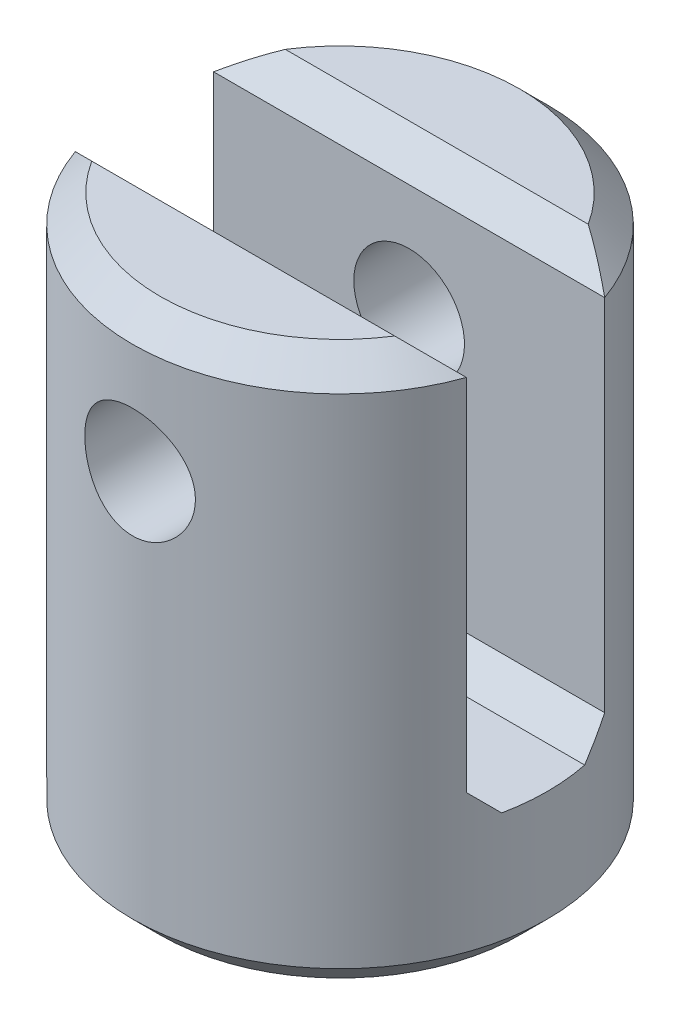
ISO-10303-21;
HEADER;
FILE_DESCRIPTION(('STEP AP214'),'2;1');
FILE_NAME('part.step','',(''),(''),'','','');
FILE_SCHEMA(('AUTOMOTIVE_DESIGN { 1 0 10303 214 1 1 1 1 }'));
ENDSEC;
DATA;
#1=APPLICATION_CONTEXT('core data for automotive mechanical design processes');
#2=APPLICATION_PROTOCOL_DEFINITION('international standard','automotive_design',2000,#1);
#3=PRODUCT_CONTEXT('',#1,'mechanical');
#4=PRODUCT('Part','Part','',(#3));
#5=PRODUCT_RELATED_PRODUCT_CATEGORY('part','',(#4));
#6=PRODUCT_DEFINITION_FORMATION('','',#4);
#7=PRODUCT_DEFINITION_CONTEXT('part definition',#1,'design');
#8=PRODUCT_DEFINITION('design','',#6,#7);
#9=PRODUCT_DEFINITION_SHAPE('','',#8);
#10=(LENGTH_UNIT() NAMED_UNIT(*) SI_UNIT(.MILLI.,.METRE.));
#11=(NAMED_UNIT(*) PLANE_ANGLE_UNIT() SI_UNIT($,.RADIAN.));
#12=(NAMED_UNIT(*) SI_UNIT($,.STERADIAN.) SOLID_ANGLE_UNIT());
#13=UNCERTAINTY_MEASURE_WITH_UNIT(LENGTH_MEASURE(1.E-05),#10,'distance_accuracy_value','');
#14=(GEOMETRIC_REPRESENTATION_CONTEXT(3) GLOBAL_UNCERTAINTY_ASSIGNED_CONTEXT((#13)) GLOBAL_UNIT_ASSIGNED_CONTEXT((#10,
#11,#12)) REPRESENTATION_CONTEXT('',''));
#15=CARTESIAN_POINT('',(0.,0.,0.));
#16=DIRECTION('',(0.,0.,1.));
#17=DIRECTION('',(1.,0.,0.));
#18=AXIS2_PLACEMENT_3D('',#15,#16,#17);
#19=CARTESIAN_POINT('',(0.,10.,0.));
#20=DIRECTION('',(0.,1.,0.));
#21=DIRECTION('',(0.,0.,1.));
#22=AXIS2_PLACEMENT_3D('',#19,#20,#21);
#23=PLANE('',#22);
#24=CARTESIAN_POINT('',(0.,10.,0.));
#25=DIRECTION('',(0.,1.,0.));
#26=DIRECTION('',(0.,0.,1.));
#27=AXIS2_PLACEMENT_3D('',#24,#25,#26);
#28=CIRCLE('',#27,6.5);
#29=CARTESIAN_POINT('',(-5.47722557505166,10.,3.5));
#30=VERTEX_POINT('',#29);
#31=CARTESIAN_POINT('',(5.47722557505166,10.,3.5));
#32=VERTEX_POINT('',#31);
#33=EDGE_CURVE('E136',#30,#32,#28,.T.);
#34=ORIENTED_EDGE('',*,*,#33,.T.);
#35=DIRECTION('',(-1.,0.,0.));
#36=VECTOR('',#35,1.);
#37=CARTESIAN_POINT('',(-7.07106781186548,10.,3.5));
#38=LINE('',#37,#36);
#39=EDGE_CURVE('E138',#32,#30,#38,.T.);
#40=ORIENTED_EDGE('',*,*,#39,.T.);
#41=EDGE_LOOP('',(#34,#40));
#42=FACE_BOUND('',#41,.T.);
#43=ADVANCED_FACE('F39',(#42),#23,.T.);
#44=CARTESIAN_POINT('',(0.,10.,0.));
#45=DIRECTION('',(0.,-1.,0.));
#46=DIRECTION('',(0.,0.,-1.));
#47=AXIS2_PLACEMENT_3D('',#44,#45,#46);
#48=CYLINDRICAL_SURFACE('',#47,7.5);
#49=CARTESIAN_POINT('',(0.,-9.,0.));
#50=DIRECTION('',(0.,1.,0.));
#51=DIRECTION('',(0.,0.,1.));
#52=AXIS2_PLACEMENT_3D('',#49,#50,#51);
#53=CIRCLE('',#52,7.5);
#54=CARTESIAN_POINT('',(0.,-9.,7.5));
#55=VERTEX_POINT('',#54);
#56=EDGE_CURVE('E237',#55,#55,#53,.T.);
#57=ORIENTED_EDGE('',*,*,#56,.T.);
#58=EDGE_LOOP('',(#57));
#59=FACE_BOUND('',#58,.T.);
#60=CARTESIAN_POINT('',(0.,7.,-7.5));
#61=CARTESIAN_POINT('',(-0.110254555832854,6.99999738306515,-7.49999833810162));
#62=CARTESIAN_POINT('',(-0.22053716022184,6.99085238581033,-7.49754486162151));
#63=CARTESIAN_POINT('',(-0.437925451354463,6.95457876926131,-7.4879957362166));
#64=CARTESIAN_POINT('',(-0.545029583319086,6.92744149557388,-7.48089785332586));
#65=CARTESIAN_POINT('',(-0.752891589045312,6.85612833313597,-7.46284333252791));
#66=CARTESIAN_POINT('',(-0.853657451015284,6.81197441233398,-7.45189167130375));
#67=CARTESIAN_POINT('',(-1.04635368639266,6.70796275733338,-7.42728699151678));
#68=CARTESIAN_POINT('',(-1.13828347044962,6.64810397664071,-7.4136337929518));
#69=CARTESIAN_POINT('',(-1.31282950374001,6.51291648358663,-7.38474614901995));
#70=CARTESIAN_POINT('',(-1.39521168986278,6.43729133199174,-7.36948467678681));
#71=CARTESIAN_POINT('',(-1.54628713660638,6.27335151693665,-7.33927409679591));
#72=CARTESIAN_POINT('',(-1.61497863495664,6.18503522238247,-7.32432502947243));
#73=CARTESIAN_POINT('',(-1.73786409243415,5.99635176517455,-7.29615537464372));
#74=CARTESIAN_POINT('',(-1.79178877736487,5.89580367173827,-7.28296888563239));
#75=CARTESIAN_POINT('',(-1.88187548076994,5.68665988890758,-7.26021477318187));
#76=CARTESIAN_POINT('',(-1.91804077451369,5.57806568766856,-7.25064648253265));
#77=CARTESIAN_POINT('',(-1.97076920226504,5.35850446217499,-7.23649115802399));
#78=CARTESIAN_POINT('',(-1.98775670244692,5.24764646006926,-7.2317964781149));
#79=CARTESIAN_POINT('',(-2.0029703470582,5.02456231669346,-7.22759830916371));
#80=CARTESIAN_POINT('',(-2.00119999705753,4.91233643497593,-7.22809385014446));
#81=CARTESIAN_POINT('',(-1.97928510002699,4.69301458462594,-7.23412378802031));
#82=CARTESIAN_POINT('',(-1.95965406064765,4.58586281796151,-7.23951735511531));
#83=CARTESIAN_POINT('',(-1.90339748722183,4.37643166554376,-7.25451013080688));
#84=CARTESIAN_POINT('',(-1.86677059492995,4.27415266992466,-7.26410967552613));
#85=CARTESIAN_POINT('',(-1.77714356965256,4.07603185619142,-7.28655661748386));
#86=CARTESIAN_POINT('',(-1.72396341137784,3.98027566071374,-7.29943942818703));
#87=CARTESIAN_POINT('',(-1.60286503823778,3.79886584114848,-7.32698229642445));
#88=CARTESIAN_POINT('',(-1.53494392224251,3.71321421084353,-7.34164270355186));
#89=CARTESIAN_POINT('',(-1.38366607263419,3.5515110025452,-7.37167510629864));
#90=CARTESIAN_POINT('',(-1.29987812728299,3.47586368168505,-7.38705471488831));
#91=CARTESIAN_POINT('',(-1.12061766820637,3.33961121964971,-7.41636381276316));
#92=CARTESIAN_POINT('',(-1.02514469420509,3.27900667129757,-7.43029324488555));
#93=CARTESIAN_POINT('',(-0.824598255497452,3.17438209717535,-7.45521820398293));
#94=CARTESIAN_POINT('',(-0.719484902551789,3.13043522955141,-7.4662007283356));
#95=CARTESIAN_POINT('',(-0.503002294390396,3.06095281118663,-7.48390044400999));
#96=CARTESIAN_POINT('',(-0.391634411928323,3.03541323727604,-7.49061856733749));
#97=CARTESIAN_POINT('',(-0.169254083145515,3.00410512308217,-7.49889158558384));
#98=CARTESIAN_POINT('',(-0.0583242376413801,2.99778696014913,-7.50058997470959));
#99=CARTESIAN_POINT('',(0.163010045901199,3.00358316424694,-7.49904471691695));
#100=CARTESIAN_POINT('',(0.273414537062114,3.01569562610577,-7.49580158080353));
#101=CARTESIAN_POINT('',(0.48860244990178,3.05755844745998,-7.48483035496021));
#102=CARTESIAN_POINT('',(0.593449852027782,3.08700224619777,-7.4771802654633));
#103=CARTESIAN_POINT('',(0.796706971176065,3.16233594450795,-7.45826294894139));
#104=CARTESIAN_POINT('',(0.895115989216027,3.20822762625054,-7.44699532996161));
#105=CARTESIAN_POINT('',(1.08483847466795,3.31617388718054,-7.42175660559529));
#106=CARTESIAN_POINT('',(1.17597518846118,3.37852746679774,-7.40773686604957));
#107=CARTESIAN_POINT('',(1.34668463539715,3.51725163015799,-7.37861452365564));
#108=CARTESIAN_POINT('',(1.42625507879918,3.59362498260106,-7.3635117072752));
#109=CARTESIAN_POINT('',(1.57388924478774,3.76078557749456,-7.33339745866705));
#110=CARTESIAN_POINT('',(1.64156519249816,3.85191856139517,-7.31840061429312));
#111=CARTESIAN_POINT('',(1.76067191185118,4.04456469609962,-7.29066447182728));
#112=CARTESIAN_POINT('',(1.81210336122161,4.1460774136223,-7.27792507956316));
#113=CARTESIAN_POINT('',(1.89687411586112,4.3560953070761,-7.2562926837321));
#114=CARTESIAN_POINT('',(1.93031812253958,4.46455581181758,-7.24737748318009));
#115=CARTESIAN_POINT('',(1.97841205118791,4.68583931967475,-7.23439825126801));
#116=CARTESIAN_POINT('',(1.99306677602478,4.79866120034792,-7.23033298020014));
#117=CARTESIAN_POINT('',(2.00288989653714,5.0214947878838,-7.22761744573589));
#118=CARTESIAN_POINT('',(1.99868155618109,5.13147732025829,-7.22879397743239));
#119=CARTESIAN_POINT('',(1.97234376000439,5.34910351401003,-7.23602396081087));
#120=CARTESIAN_POINT('',(1.95021476535025,5.45674723550058,-7.24207728699439));
#121=CARTESIAN_POINT('',(1.88902515699699,5.66585575212985,-7.25827571073158));
#122=CARTESIAN_POINT('',(1.8500966107558,5.76736184273218,-7.26838885019644));
#123=CARTESIAN_POINT('',(1.75651554562386,5.96247883053414,-7.29156818136177));
#124=CARTESIAN_POINT('',(1.70186056024617,6.05608848630049,-7.30463483621364));
#125=CARTESIAN_POINT('',(1.57648909268817,6.23573035949661,-7.3327292144046));
#126=CARTESIAN_POINT('',(1.50534729767909,6.32145853497621,-7.3478033310169));
#127=CARTESIAN_POINT('',(1.349830535111,6.47996245166733,-7.37795503783007));
#128=CARTESIAN_POINT('',(1.26545235435875,6.55273503866884,-7.39303262798441));
#129=CARTESIAN_POINT('',(1.08367998108869,6.68479223764686,-7.42187812403968));
#130=CARTESIAN_POINT('',(0.98604596175178,6.74375501064933,-7.43561111314551));
#131=CARTESIAN_POINT('',(0.78188864041689,6.84433741592936,-7.45983810102898));
#132=CARTESIAN_POINT('',(0.675371094696298,6.8859681756636,-7.47033417683594));
#133=CARTESIAN_POINT('',(0.474374704880992,6.94527528541552,-7.48554752513468));
#134=CARTESIAN_POINT('',(0.380762016565037,6.9657493835925,-7.49092770592602));
#135=CARTESIAN_POINT('',(0.191439795317077,6.99311220616706,-7.49815449036456));
#136=CARTESIAN_POINT('',(0.0957304704048606,7.00000227220002,-7.5000014429727));
#137=CARTESIAN_POINT('',(0.,7.,-7.5));
#138=B_SPLINE_CURVE_WITH_KNOTS('',3,(#60,#61,#62,#63,#64,#65,#66,#67,#68,#69,#70,#71,#72,#73,
#74,#75,#76,#77,#78,#79,#80,#81,#82,#83,#84,#85,#86,#87,#88,#89,#90,#91,#92,#93,#94,#95,#96,#97,
#98,#99,#100,#101,#102,#103,#104,#105,#106,#107,#108,#109,#110,#111,#112,#113,#114,#115,#116,
#117,#118,#119,#120,#121,#122,#123,#124,#125,#126,#127,#128,#129,#130,#131,#132,#133,#134,#135,
#136,#137),.UNSPECIFIED.,.T.,.F.,(4,2,2,2,2,2,2,2,2,2,2,2,2,2,2,2,2,2,2,2,2,2,2,2,2,2,2,2,2,2,2,
2,2,2,2,2,2,2,4),(0.,0.330412598949569,0.660984243761449,0.991130552971932,1.32129886708675,
1.65834897954967,1.99544244925149,2.33832582523229,2.681145941297,3.01622158250468,
3.3512346040432,3.67691002045996,4.00261146812939,4.33198673346498,4.6614268811763,
5.00161259812322,5.34181171937597,5.68348809603041,6.02508977190139,6.35682717524547,
6.6885302892535,7.01453535642116,7.34057575775614,7.6730028600455,8.00549568258887,
8.34736496382788,8.68921998024107,9.02906297699386,9.36881908663982,9.69743342403611,
10.0260393052059,10.352107654483,10.67822717123,11.0139433957139,11.3497412433245,
11.692722522809,12.0354832614518,12.3223981899334,12.6092847796638),.UNSPECIFIED.);
#139=CARTESIAN_POINT('',(0.,7.,-7.5));
#140=VERTEX_POINT('',#139);
#141=EDGE_CURVE('E216',#140,#140,#138,.T.);
#142=ORIENTED_EDGE('',*,*,#141,.T.);
#143=EDGE_LOOP('',(#142));
#144=FACE_BOUND('',#143,.T.);
#145=CARTESIAN_POINT('',(2.,5.,7.22841614740048));
#146=CARTESIAN_POINT('',(1.99999734315871,4.88982406225972,7.22841805697252));
#147=CARTESIAN_POINT('',(1.99086493224743,4.77961999952398,7.23096264549673));
#148=CARTESIAN_POINT('',(1.95464583260237,4.56239457844363,7.24083561155097));
#149=CARTESIAN_POINT('',(1.92755013620953,4.45537484502194,7.24816638907934));
#150=CARTESIAN_POINT('',(1.85635845560074,4.24769193005322,7.26672375176839));
#151=CARTESIAN_POINT('',(1.81228637542178,4.14702004117157,7.27794485684204));
#152=CARTESIAN_POINT('',(1.70846784563704,3.95448325994017,7.30301154920402));
#153=CARTESIAN_POINT('',(1.6487201784145,3.86261905249301,7.31685734034424));
#154=CARTESIAN_POINT('',(1.5136484787456,3.68800745301228,7.34600139553467));
#155=CARTESIAN_POINT('',(1.43800297504208,3.60551298253554,7.36132541116443));
#156=CARTESIAN_POINT('',(1.27397427284021,3.4542184230488,7.39147701436507));
#157=CARTESIAN_POINT('',(1.18558975534665,3.38541975385821,7.40630455033439));
#158=CARTESIAN_POINT('',(0.996838170873271,3.26241506159707,7.43407988468418));
#159=CARTESIAN_POINT('',(0.896301819879481,3.20846048136714,7.44699376262293));
#160=CARTESIAN_POINT('',(0.687183044729092,3.11831536463274,7.46919126211834));
#161=CARTESIAN_POINT('',(0.578601980875104,3.08212183271844,7.47847549576262));
#162=CARTESIAN_POINT('',(0.359115961810091,3.02934477976423,7.49218553576461));
#163=CARTESIAN_POINT('',(0.248321224200917,3.01233102337408,7.49671776750265));
#164=CARTESIAN_POINT('',(0.0253635535085766,2.99704287989282,7.5007852461775));
#165=CARTESIAN_POINT('',(-0.0867991474385289,2.99876535636986,7.50032132946608));
#166=CARTESIAN_POINT('',(-0.306314237111346,3.02059781253947,7.49452675859765));
#167=CARTESIAN_POINT('',(-0.413716600721109,3.04024295763629,7.48931914026999));
#168=CARTESIAN_POINT('',(-0.623641315571054,3.09661213778195,7.4747674859047));
#169=CARTESIAN_POINT('',(-0.72616338818058,3.13333714668604,7.46542321400589));
#170=CARTESIAN_POINT('',(-0.924603945147553,3.22317984759238,7.44346569099892));
#171=CARTESIAN_POINT('',(-1.02044668632954,3.2764568071007,7.43082087877672));
#172=CARTESIAN_POINT('',(-1.20198999876451,3.3977688195091,7.40362468509504));
#173=CARTESIAN_POINT('',(-1.28768858808586,3.46580674902818,7.38907293223));
#174=CARTESIAN_POINT('',(-1.44928536946561,3.61717685793391,7.35911272938719));
#175=CARTESIAN_POINT('',(-1.52480192017773,3.70091444504936,7.34369169368738));
#176=CARTESIAN_POINT('',(-1.6608133210477,3.88002467623882,7.31413405023521));
#177=CARTESIAN_POINT('',(-1.72130725529808,3.97539802920045,7.29999752083065));
#178=CARTESIAN_POINT('',(-1.82584679186274,4.17590010182131,7.27455902280777));
#179=CARTESIAN_POINT('',(-1.86978866600526,4.28108535091316,7.26327507092156));
#180=CARTESIAN_POINT('',(-1.93924001685674,4.49772649945497,7.24504325087515));
#181=CARTESIAN_POINT('',(-1.96475406461341,4.60918083645033,7.23809430746845));
#182=CARTESIAN_POINT('',(-1.99596757092855,4.83162721102836,7.22954835612976));
#183=CARTESIAN_POINT('',(-2.00223632621177,4.94253354862131,7.22779763213457));
#184=CARTESIAN_POINT('',(-1.9963498112297,5.16380977280855,7.22942578390815));
#185=CARTESIAN_POINT('',(-1.98419650172323,5.27417971523995,7.23280411376438));
#186=CARTESIAN_POINT('',(-1.94231271869971,5.48905659409155,7.24416124318865));
#187=CARTESIAN_POINT('',(-1.91292447912922,5.59363543793723,7.25205039699299));
#188=CARTESIAN_POINT('',(-1.83778986725474,5.79637963135994,7.27145268952784));
#189=CARTESIAN_POINT('',(-1.79204135876651,5.89454414142743,7.28296630148564));
#190=CARTESIAN_POINT('',(-1.68432905508707,6.08405495743521,7.30863572472984));
#191=CARTESIAN_POINT('',(-1.62203095237924,6.17520397588973,7.32284404872864));
#192=CARTESIAN_POINT('',(-1.48340227987515,6.34596330170316,7.35217841933666));
#193=CARTESIAN_POINT('',(-1.40706907222966,6.42557143495415,7.36730463810238));
#194=CARTESIAN_POINT('',(-1.23990378250484,6.57335247324992,7.39729964884456));
#195=CARTESIAN_POINT('',(-1.14871641600885,6.64112837697858,7.41214836523849));
#196=CARTESIAN_POINT('',(-0.955928435940743,6.76041098741052,7.43946670017127));
#197=CARTESIAN_POINT('',(-0.854328377018883,6.81191856007892,7.45193644532905));
#198=CARTESIAN_POINT('',(-0.644314134825872,6.89672963236151,7.47301150899261));
#199=CARTESIAN_POINT('',(-0.535957852882336,6.93016901944347,7.48164558480385));
#200=CARTESIAN_POINT('',(-0.314899384731319,6.97828872806436,7.49420303787247));
#201=CARTESIAN_POINT('',(-0.202198167320242,6.99297320677468,7.4981274590498));
#202=CARTESIAN_POINT('',(0.0206420013461502,7.00290582374144,7.50077413437691));
#203=CARTESIAN_POINT('',(0.130753511527865,6.99873631913117,7.49965226288082));
#204=CARTESIAN_POINT('',(0.348648304630719,6.97243150642479,7.4926849097886));
#205=CARTESIAN_POINT('',(0.456431674812815,6.95029687288295,7.48683960554786));
#206=CARTESIAN_POINT('',(0.665910123464211,6.8890193950814,7.47111310390923));
#207=CARTESIAN_POINT('',(0.767642011851542,6.84999470652756,7.46125997189229));
#208=CARTESIAN_POINT('',(0.963172098471355,6.75615039825376,7.43854816516494));
#209=CARTESIAN_POINT('',(1.05696918166215,6.70132856338719,7.42568906899253));
#210=CARTESIAN_POINT('',(1.23667826867367,6.57574172786298,7.39791331224122));
#211=CARTESIAN_POINT('',(1.32231336173331,6.50459061930134,7.38295093371636));
#212=CARTESIAN_POINT('',(1.48062537156133,6.34909725063509,7.35284000077256));
#213=CARTESIAN_POINT('',(1.55329887243048,6.26475152418065,7.33769139839721));
#214=CARTESIAN_POINT('',(1.68520700232562,6.0830316041824,7.30853959638856));
#215=CARTESIAN_POINT('',(1.74411094261234,5.98541168634279,7.29456891224646));
#216=CARTESIAN_POINT('',(1.84458689030054,5.78129368913976,7.26981393903472));
#217=CARTESIAN_POINT('',(1.88617023367332,5.67480147146052,7.25902756724947));
#218=CARTESIAN_POINT('',(1.94538124252481,5.47391866394875,7.24336000653874));
#219=CARTESIAN_POINT('',(1.96581518399489,5.38039873544328,7.23780140272195));
#220=CARTESIAN_POINT('',(1.9931249429388,5.19125944200603,7.2303288521157));
#221=CARTESIAN_POINT('',(2.0000023063216,5.09564031771119,7.22841448976017));
#222=CARTESIAN_POINT('',(2.,5.,7.22841614740048));
#223=B_SPLINE_CURVE_WITH_KNOTS('',3,(#145,#146,#147,#148,#149,#150,#151,#152,#153,#154,#155,
#156,#157,#158,#159,#160,#161,#162,#163,#164,#165,#166,#167,#168,#169,#170,#171,#172,#173,#174,
#175,#176,#177,#178,#179,#180,#181,#182,#183,#184,#185,#186,#187,#188,#189,#190,#191,#192,#193,
#194,#195,#196,#197,#198,#199,#200,#201,#202,#203,#204,#205,#206,#207,#208,#209,#210,#211,#212,
#213,#214,#215,#216,#217,#218,#219,#220,#221,#222),.UNSPECIFIED.,.T.,.F.,(4,2,2,2,2,2,2,2,2,2,2,
2,2,2,2,2,2,2,2,2,2,2,2,2,2,2,2,2,2,2,2,2,2,2,2,2,2,2,4),(0.,0.330176128116026,
0.660517947850201,0.990396311596168,1.32030030656105,1.65765916130211,1.99505297124461,
2.33785207370803,2.68059334304246,3.0154830431648,3.35031668385603,3.67670570800803,
4.00311334440695,4.3327644890557,4.66247993394491,5.0023176230033,5.34217602639579,
5.68413015096536,6.02599942418508,6.35765334242023,6.68927196343503,7.01451850432574,
7.33980752864823,7.67224634967772,8.00474771541474,8.34685906959633,8.68895221008103,
9.02843539591401,9.36784331959005,9.69684054916463,10.0258254261296,10.3525451486867,
10.6793107076596,11.0147885399158,11.3503546538105,11.6933003898558,12.0360213210131,
12.3226696767153,12.6092853429065),.UNSPECIFIED.);
#224=CARTESIAN_POINT('',(2.,5.,7.22841614740048));
#225=VERTEX_POINT('',#224);
#226=EDGE_CURVE('E221',#225,#225,#223,.T.);
#227=ORIENTED_EDGE('',*,*,#226,.T.);
#228=EDGE_LOOP('',(#227));
#229=FACE_BOUND('',#228,.T.);
#230=CARTESIAN_POINT('',(0.,-5.,0.));
#231=DIRECTION('',(0.,-1.,0.));
#232=DIRECTION('',(0.,0.,-1.));
#233=AXIS2_PLACEMENT_3D('',#230,#231,#232);
#234=CIRCLE('',#233,7.5);
#235=CARTESIAN_POINT('',(-7.34846922834954,-5.,1.5));
#236=VERTEX_POINT('',#235);
#237=CARTESIAN_POINT('',(-7.34846922834953,-5.,-1.50000000000001));
#238=VERTEX_POINT('',#237);
#239=EDGE_CURVE('E210',#236,#238,#234,.T.);
#240=ORIENTED_EDGE('',*,*,#239,.T.);
#241=CARTESIAN_POINT('',(0.,-6.50000000000002,0.));
#242=DIRECTION('',(0.,0.707106781186544,0.707106781186551));
#243=DIRECTION('',(0.,-0.707106781186551,0.707106781186544));
#244=AXIS2_PLACEMENT_3D('',#241,#242,#243);
#245=ELLIPSE('',#244,10.6066017177983,7.5);
#246=CARTESIAN_POINT('',(-7.07106781186548,-4.,-2.5));
#247=VERTEX_POINT('',#246);
#248=EDGE_CURVE('E11',#238,#247,#245,.F.);
#249=ORIENTED_EDGE('',*,*,#248,.T.);
#250=DIRECTION('',(0.,-1.,0.));
#251=VECTOR('',#250,1.);
#252=CARTESIAN_POINT('',(-7.07106781186548,10.,-2.5));
#253=LINE('',#252,#251);
#254=CARTESIAN_POINT('',(-7.07106781186548,9.,-2.5));
#255=VERTEX_POINT('',#254);
#256=EDGE_CURVE('E215',#247,#255,#253,.F.);
#257=ORIENTED_EDGE('',*,*,#256,.T.);
#258=CARTESIAN_POINT('',(0.,9.,0.));
#259=DIRECTION('',(0.,1.,0.));
#260=DIRECTION('',(0.,0.,1.));
#261=AXIS2_PLACEMENT_3D('',#258,#259,#260);
#262=CIRCLE('',#261,7.5);
#263=CARTESIAN_POINT('',(7.07106781186548,9.,-2.5));
#264=VERTEX_POINT('',#263);
#265=EDGE_CURVE('E111',#255,#264,#262,.F.);
#266=ORIENTED_EDGE('',*,*,#265,.T.);
#267=DIRECTION('',(0.,-1.,0.));
#268=VECTOR('',#267,1.);
#269=CARTESIAN_POINT('',(7.07106781186548,10.,-2.5));
#270=LINE('',#269,#268);
#271=CARTESIAN_POINT('',(7.07106781186548,-4.,-2.5));
#272=VERTEX_POINT('',#271);
#273=EDGE_CURVE('E205',#264,#272,#270,.T.);
#274=ORIENTED_EDGE('',*,*,#273,.T.);
#275=CARTESIAN_POINT('',(0.,-6.50000000000002,0.));
#276=DIRECTION('',(0.,0.707106781186544,0.707106781186551));
#277=DIRECTION('',(0.,-0.707106781186551,0.707106781186544));
#278=AXIS2_PLACEMENT_3D('',#275,#276,#277);
#279=ELLIPSE('',#278,10.6066017177983,7.5);
#280=CARTESIAN_POINT('',(7.34846922834953,-5.,-1.50000000000001));
#281=VERTEX_POINT('',#280);
#282=EDGE_CURVE('E48',#272,#281,#279,.F.);
#283=ORIENTED_EDGE('',*,*,#282,.T.);
#284=CARTESIAN_POINT('',(7.34846922834954,-5.,1.5));
#285=VERTEX_POINT('',#284);
#286=EDGE_CURVE('E203',#281,#285,#234,.T.);
#287=ORIENTED_EDGE('',*,*,#286,.T.);
#288=CARTESIAN_POINT('',(0.,-6.49999999999999,0.));
#289=DIRECTION('',(0.,0.70710678118655,-0.707106781186545));
#290=DIRECTION('',(0.,-0.707106781186545,-0.70710678118655));
#291=AXIS2_PLACEMENT_3D('',#288,#289,#290);
#292=ELLIPSE('',#291,10.6066017177982,7.5);
#293=CARTESIAN_POINT('',(7.07106781186548,-4.,2.5));
#294=VERTEX_POINT('',#293);
#295=EDGE_CURVE('E196',#285,#294,#292,.F.);
#296=ORIENTED_EDGE('',*,*,#295,.T.);
#297=DIRECTION('',(0.,-1.,0.));
#298=VECTOR('',#297,1.);
#299=CARTESIAN_POINT('',(7.07106781186548,10.,2.5));
#300=LINE('',#299,#298);
#301=CARTESIAN_POINT('',(7.07106781186548,9.,2.5));
#302=VERTEX_POINT('',#301);
#303=EDGE_CURVE('E218',#294,#302,#300,.F.);
#304=ORIENTED_EDGE('',*,*,#303,.T.);
#305=CARTESIAN_POINT('',(0.,9.,0.));
#306=DIRECTION('',(0.,1.,0.));
#307=DIRECTION('',(0.,0.,1.));
#308=AXIS2_PLACEMENT_3D('',#305,#306,#307);
#309=CIRCLE('',#308,7.5);
#310=CARTESIAN_POINT('',(-7.07106781186548,9.,2.5));
#311=VERTEX_POINT('',#310);
#312=EDGE_CURVE('E124',#302,#311,#309,.F.);
#313=ORIENTED_EDGE('',*,*,#312,.T.);
#314=DIRECTION('',(0.,-1.,0.));
#315=VECTOR('',#314,1.);
#316=CARTESIAN_POINT('',(-7.07106781186548,10.,2.5));
#317=LINE('',#316,#315);
#318=CARTESIAN_POINT('',(-7.07106781186548,-4.,2.5));
#319=VERTEX_POINT('',#318);
#320=EDGE_CURVE('E211',#311,#319,#317,.T.);
#321=ORIENTED_EDGE('',*,*,#320,.T.);
#322=CARTESIAN_POINT('',(0.,-6.49999999999999,0.));
#323=DIRECTION('',(0.,0.70710678118655,-0.707106781186545));
#324=DIRECTION('',(0.,-0.707106781186545,-0.70710678118655));
#325=AXIS2_PLACEMENT_3D('',#322,#323,#324);
#326=ELLIPSE('',#325,10.6066017177982,7.5);
#327=EDGE_CURVE('E198',#319,#236,#326,.F.);
#328=ORIENTED_EDGE('',*,*,#327,.T.);
#329=EDGE_LOOP('',(#240,#249,#257,#266,#274,#283,#287,#296,#304,#313,#321,#328));
#330=FACE_BOUND('',#329,.T.);
#331=ADVANCED_FACE('F202',(#59,#144,#229,#330),#48,.T.);
#332=DIRECTION('',(1.,0.,0.));
#333=VECTOR('',#332,1.);
#334=CARTESIAN_POINT('',(7.07106781186548,10.,-3.50000000000001));
#335=LINE('',#334,#333);
#336=CARTESIAN_POINT('',(-5.47722557505165,10.,-3.50000000000001));
#337=VERTEX_POINT('',#336);
#338=CARTESIAN_POINT('',(5.47722557505165,10.,-3.50000000000001));
#339=VERTEX_POINT('',#338);
#340=EDGE_CURVE('E118',#337,#339,#335,.T.);
#341=ORIENTED_EDGE('',*,*,#340,.T.);
#342=CARTESIAN_POINT('',(0.,10.,0.));
#343=DIRECTION('',(0.,1.,0.));
#344=DIRECTION('',(0.,0.,1.));
#345=AXIS2_PLACEMENT_3D('',#342,#343,#344);
#346=CIRCLE('',#345,6.49999999999999);
#347=EDGE_CURVE('E109',#339,#337,#346,.T.);
#348=ORIENTED_EDGE('',*,*,#347,.T.);
#349=EDGE_LOOP('',(#341,#348));
#350=FACE_BOUND('',#349,.T.);
#351=ADVANCED_FACE('F123',(#350),#23,.T.);
#352=CARTESIAN_POINT('',(0.,-10.,0.));
#353=DIRECTION('',(0.,1.,0.));
#354=DIRECTION('',(0.,0.,1.));
#355=AXIS2_PLACEMENT_3D('',#352,#353,#354);
#356=PLANE('',#355);
#357=CARTESIAN_POINT('',(0.,-10.,0.));
#358=DIRECTION('',(0.,1.,0.));
#359=DIRECTION('',(0.,0.,1.));
#360=AXIS2_PLACEMENT_3D('',#357,#358,#359);
#361=CIRCLE('',#360,6.5);
#362=CARTESIAN_POINT('',(0.,-10.,6.5));
#363=VERTEX_POINT('',#362);
#364=EDGE_CURVE('E121',#363,#363,#361,.F.);
#365=ORIENTED_EDGE('',*,*,#364,.T.);
#366=EDGE_LOOP('',(#365));
#367=FACE_BOUND('',#366,.T.);
#368=ADVANCED_FACE('F242',(#367),#356,.F.);
#369=CARTESIAN_POINT('',(-7.5,-5.,2.5));
#370=DIRECTION('',(0.,-1.,0.));
#371=DIRECTION('',(0.,0.,-1.));
#372=AXIS2_PLACEMENT_3D('',#369,#370,#371);
#373=PLANE('',#372);
#374=ORIENTED_EDGE('',*,*,#239,.F.);
#375=DIRECTION('',(1.,0.,0.));
#376=VECTOR('',#375,1.);
#377=CARTESIAN_POINT('',(7.07106781186548,-5.,1.5));
#378=LINE('',#377,#376);
#379=EDGE_CURVE('E189',#236,#285,#378,.T.);
#380=ORIENTED_EDGE('',*,*,#379,.T.);
#381=ORIENTED_EDGE('',*,*,#286,.F.);
#382=DIRECTION('',(-1.,0.,0.));
#383=VECTOR('',#382,1.);
#384=CARTESIAN_POINT('',(-7.07106781186548,-5.,-1.50000000000001));
#385=LINE('',#384,#383);
#386=EDGE_CURVE('E140',#281,#238,#385,.T.);
#387=ORIENTED_EDGE('',*,*,#386,.T.);
#388=EDGE_LOOP('',(#374,#380,#381,#387));
#389=FACE_BOUND('',#388,.T.);
#390=ADVANCED_FACE('F208',(#389),#373,.F.);
#391=CARTESIAN_POINT('',(-7.5,10.,2.5));
#392=DIRECTION('',(0.,0.,1.));
#393=DIRECTION('',(1.,0.,0.));
#394=AXIS2_PLACEMENT_3D('',#391,#392,#393);
#395=PLANE('',#394);
#396=CARTESIAN_POINT('',(0.,5.,2.5));
#397=DIRECTION('',(0.,0.,1.));
#398=DIRECTION('',(1.,0.,0.));
#399=AXIS2_PLACEMENT_3D('',#396,#397,#398);
#400=CIRCLE('',#399,2.);
#401=CARTESIAN_POINT('',(2.,5.,2.5));
#402=VERTEX_POINT('',#401);
#403=EDGE_CURVE('E236',#402,#402,#400,.T.);
#404=ORIENTED_EDGE('',*,*,#403,.T.);
#405=EDGE_LOOP('',(#404));
#406=FACE_BOUND('',#405,.T.);
#407=ORIENTED_EDGE('',*,*,#303,.F.);
#408=DIRECTION('',(-1.,0.,0.));
#409=VECTOR('',#408,1.);
#410=CARTESIAN_POINT('',(-7.07106781186548,-4.,2.5));
#411=LINE('',#410,#409);
#412=EDGE_CURVE('E192',#294,#319,#411,.T.);
#413=ORIENTED_EDGE('',*,*,#412,.T.);
#414=ORIENTED_EDGE('',*,*,#320,.F.);
#415=DIRECTION('',(1.,0.,0.));
#416=VECTOR('',#415,1.);
#417=CARTESIAN_POINT('',(7.07106781186547,9.,2.5));
#418=LINE('',#417,#416);
#419=EDGE_CURVE('E133',#311,#302,#418,.T.);
#420=ORIENTED_EDGE('',*,*,#419,.T.);
#421=EDGE_LOOP('',(#407,#413,#414,#420));
#422=FACE_BOUND('',#421,.T.);
#423=ADVANCED_FACE('F272',(#406,#422),#395,.F.);
#424=CARTESIAN_POINT('',(-7.5,10.,-2.5));
#425=DIRECTION('',(0.,0.,-1.));
#426=DIRECTION('',(-1.,0.,0.));
#427=AXIS2_PLACEMENT_3D('',#424,#425,#426);
#428=PLANE('',#427);
#429=CARTESIAN_POINT('',(0.,5.,-2.5));
#430=DIRECTION('',(0.,0.,-1.));
#431=DIRECTION('',(-1.,0.,0.));
#432=AXIS2_PLACEMENT_3D('',#429,#430,#431);
#433=CIRCLE('',#432,2.);
#434=CARTESIAN_POINT('',(-2.,5.,-2.5));
#435=VERTEX_POINT('',#434);
#436=EDGE_CURVE('E233',#435,#435,#433,.T.);
#437=ORIENTED_EDGE('',*,*,#436,.T.);
#438=EDGE_LOOP('',(#437));
#439=FACE_BOUND('',#438,.T.);
#440=ORIENTED_EDGE('',*,*,#256,.F.);
#441=DIRECTION('',(1.,0.,0.));
#442=VECTOR('',#441,1.);
#443=CARTESIAN_POINT('',(7.07106781186548,-4.,-2.5));
#444=LINE('',#443,#442);
#445=EDGE_CURVE('E194',#247,#272,#444,.T.);
#446=ORIENTED_EDGE('',*,*,#445,.T.);
#447=ORIENTED_EDGE('',*,*,#273,.F.);
#448=DIRECTION('',(-1.,0.,0.));
#449=VECTOR('',#448,1.);
#450=CARTESIAN_POINT('',(-7.07106781186548,9.,-2.5));
#451=LINE('',#450,#449);
#452=EDGE_CURVE('E130',#264,#255,#451,.T.);
#453=ORIENTED_EDGE('',*,*,#452,.T.);
#454=EDGE_LOOP('',(#440,#446,#447,#453));
#455=FACE_BOUND('',#454,.T.);
#456=ADVANCED_FACE('F214',(#439,#455),#428,.F.);
#457=CARTESIAN_POINT('',(0.,5.,-7.5));
#458=DIRECTION('',(0.,0.,1.));
#459=DIRECTION('',(1.,0.,0.));
#460=AXIS2_PLACEMENT_3D('',#457,#458,#459);
#461=CYLINDRICAL_SURFACE('',#460,2.);
#462=ORIENTED_EDGE('',*,*,#436,.F.);
#463=EDGE_LOOP('',(#462));
#464=FACE_BOUND('',#463,.T.);
#465=ORIENTED_EDGE('',*,*,#141,.F.);
#466=EDGE_LOOP('',(#465));
#467=FACE_BOUND('',#466,.T.);
#468=ADVANCED_FACE('F264',(#464,#467),#461,.F.);
#469=ORIENTED_EDGE('',*,*,#403,.F.);
#470=EDGE_LOOP('',(#469));
#471=FACE_BOUND('',#470,.T.);
#472=ORIENTED_EDGE('',*,*,#226,.F.);
#473=EDGE_LOOP('',(#472));
#474=FACE_BOUND('',#473,.T.);
#475=ADVANCED_FACE('F247',(#471,#474),#461,.F.);
#476=CARTESIAN_POINT('',(0.,-9.,0.));
#477=DIRECTION('',(0.,1.,0.));
#478=DIRECTION('',(0.,0.,1.));
#479=AXIS2_PLACEMENT_3D('',#476,#477,#478);
#480=CONICAL_SURFACE('',#479,7.5,0.78539816339745);
#481=ORIENTED_EDGE('',*,*,#364,.F.);
#482=EDGE_LOOP('',(#481));
#483=FACE_BOUND('',#482,.T.);
#484=ORIENTED_EDGE('',*,*,#56,.F.);
#485=EDGE_LOOP('',(#484));
#486=FACE_BOUND('',#485,.T.);
#487=ADVANCED_FACE('F244',(#483,#486),#480,.T.);
#488=CARTESIAN_POINT('',(-7.5,9.,-2.5));
#489=DIRECTION('',(0.,0.70710678118655,0.707106781186545));
#490=DIRECTION('',(1.,0.,0.));
#491=AXIS2_PLACEMENT_3D('',#488,#489,#490);
#492=PLANE('',#491);
#493=CARTESIAN_POINT('',(-5.47722557505165,10.,-3.50000000000001));
#494=CARTESIAN_POINT('',(-5.61778499093026,9.92300532369892,-3.42300532369893));
#495=CARTESIAN_POINT('',(-5.75631014817891,9.84417559594065,-3.34417559594066));
#496=CARTESIAN_POINT('',(-6.02933251308635,9.68329008073219,-3.18329008073219));
#497=CARTESIAN_POINT('',(-6.16383358088199,9.60123757176323,-3.10123757176323));
#498=CARTESIAN_POINT('',(-6.42910214879407,9.43421167096484,-2.93421167096485));
#499=CARTESIAN_POINT('',(-6.55987033136427,9.34923881938063,-2.84923881938064));
#500=CARTESIAN_POINT('',(-6.81800898268265,9.17656980587199,-2.67656980587199));
#501=CARTESIAN_POINT('',(-6.94537594980451,9.088871024359,-2.588871024359));
#502=CARTESIAN_POINT('',(-7.07106781186548,9.,-2.5));
#503=B_SPLINE_CURVE_WITH_KNOTS('',3,(#493,#494,#495,#496,#497,#498,#499,#500,#501,#502),
.UNSPECIFIED.,.F.,.F.,(4,2,2,2,4),(0.,0.533346262492617,1.06616334197239,1.59888237863203,
2.13213022361402),.UNSPECIFIED.);
#504=EDGE_CURVE('E105',#255,#337,#503,.F.);
#505=ORIENTED_EDGE('',*,*,#504,.F.);
#506=ORIENTED_EDGE('',*,*,#452,.F.);
#507=CARTESIAN_POINT('',(7.07106781186548,9.,-2.5));
#508=CARTESIAN_POINT('',(6.94537594980451,9.088871024359,-2.588871024359));
#509=CARTESIAN_POINT('',(6.81800898268265,9.17656980587199,-2.67656980587199));
#510=CARTESIAN_POINT('',(6.55987033136427,9.34923881938063,-2.84923881938064));
#511=CARTESIAN_POINT('',(6.42910214879407,9.43421167096484,-2.93421167096485));
#512=CARTESIAN_POINT('',(6.16383358088199,9.60123757176323,-3.10123757176323));
#513=CARTESIAN_POINT('',(6.02933251308635,9.68329008073219,-3.18329008073219));
#514=CARTESIAN_POINT('',(5.75631014817891,9.84417559594065,-3.34417559594066));
#515=CARTESIAN_POINT('',(5.61778499093026,9.92300532369892,-3.42300532369893));
#516=CARTESIAN_POINT('',(5.47722557505165,10.,-3.50000000000001));
#517=B_SPLINE_CURVE_WITH_KNOTS('',3,(#507,#508,#509,#510,#511,#512,#513,#514,#515,#516),
.UNSPECIFIED.,.F.,.F.,(4,2,2,2,4),(0.,0.533247844981981,1.06596688164163,1.5987839611214,
2.13213022361402),.UNSPECIFIED.);
#518=EDGE_CURVE('E114',#339,#264,#517,.F.);
#519=ORIENTED_EDGE('',*,*,#518,.F.);
#520=ORIENTED_EDGE('',*,*,#340,.F.);
#521=EDGE_LOOP('',(#505,#506,#519,#520));
#522=FACE_BOUND('',#521,.T.);
#523=ADVANCED_FACE('F119',(#522),#492,.T.);
#524=CARTESIAN_POINT('',(0.,10.,0.));
#525=DIRECTION('',(0.,-1.,0.));
#526=DIRECTION('',(0.,0.,-1.));
#527=AXIS2_PLACEMENT_3D('',#524,#525,#526);
#528=CONICAL_SURFACE('',#527,6.49999999999999,0.785398163397452);
#529=ORIENTED_EDGE('',*,*,#518,.T.);
#530=ORIENTED_EDGE('',*,*,#265,.F.);
#531=ORIENTED_EDGE('',*,*,#504,.T.);
#532=ORIENTED_EDGE('',*,*,#347,.F.);
#533=EDGE_LOOP('',(#529,#530,#531,#532));
#534=FACE_BOUND('',#533,.T.);
#535=ADVANCED_FACE('F107',(#534),#528,.T.);
#536=CARTESIAN_POINT('',(0.,10.,0.));
#537=DIRECTION('',(0.,-1.,0.));
#538=DIRECTION('',(0.,0.,-1.));
#539=AXIS2_PLACEMENT_3D('',#536,#537,#538);
#540=CONICAL_SURFACE('',#539,6.5,0.785398163397446);
#541=CARTESIAN_POINT('',(7.07106781186548,9.,2.5));
#542=CARTESIAN_POINT('',(6.94537594980451,9.088871024359,2.588871024359));
#543=CARTESIAN_POINT('',(6.81800898268266,9.17656980587198,2.67656980587199));
#544=CARTESIAN_POINT('',(6.55987033136427,9.34923881938063,2.84923881938063));
#545=CARTESIAN_POINT('',(6.42910214879408,9.43421167096484,2.93421167096484));
#546=CARTESIAN_POINT('',(6.163833580882,9.60123757176323,3.10123757176323));
#547=CARTESIAN_POINT('',(6.02933251308636,9.68329008073219,3.18329008073219));
#548=CARTESIAN_POINT('',(5.75631014817892,9.84417559594065,3.34417559594065));
#549=CARTESIAN_POINT('',(5.61778499093028,9.92300532369892,3.42300532369892));
#550=CARTESIAN_POINT('',(5.47722557505166,10.,3.5));
#551=B_SPLINE_CURVE_WITH_KNOTS('',3,(#541,#542,#543,#544,#545,#546,#547,#548,#549,#550),
.UNSPECIFIED.,.F.,.F.,(4,2,2,2,4),(0.,0.533247844981977,1.06596688164162,1.59878396112139,
2.132130223614),.UNSPECIFIED.);
#552=EDGE_CURVE('E177',#32,#302,#551,.F.);
#553=ORIENTED_EDGE('',*,*,#552,.F.);
#554=ORIENTED_EDGE('',*,*,#33,.F.);
#555=CARTESIAN_POINT('',(-5.47722557505166,10.,3.5));
#556=CARTESIAN_POINT('',(-5.61778499093028,9.92300532369892,3.42300532369892));
#557=CARTESIAN_POINT('',(-5.75631014817892,9.84417559594065,3.34417559594065));
#558=CARTESIAN_POINT('',(-6.02933251308637,9.68329008073219,3.18329008073219));
#559=CARTESIAN_POINT('',(-6.163833580882,9.60123757176323,3.10123757176323));
#560=CARTESIAN_POINT('',(-6.42910214879408,9.43421167096484,2.93421167096484));
#561=CARTESIAN_POINT('',(-6.55987033136427,9.34923881938063,2.84923881938063));
#562=CARTESIAN_POINT('',(-6.81800898268266,9.17656980587198,2.67656980587199));
#563=CARTESIAN_POINT('',(-6.94537594980451,9.088871024359,2.588871024359));
#564=CARTESIAN_POINT('',(-7.07106781186548,9.,2.5));
#565=B_SPLINE_CURVE_WITH_KNOTS('',3,(#555,#556,#557,#558,#559,#560,#561,#562,#563,#564),
.UNSPECIFIED.,.F.,.F.,(4,2,2,2,4),(0.,0.533346262492614,1.06616334197238,1.59888237863202,
2.132130223614),.UNSPECIFIED.);
#566=EDGE_CURVE('E115',#311,#30,#565,.F.);
#567=ORIENTED_EDGE('',*,*,#566,.F.);
#568=ORIENTED_EDGE('',*,*,#312,.F.);
#569=EDGE_LOOP('',(#553,#554,#567,#568));
#570=FACE_BOUND('',#569,.T.);
#571=ADVANCED_FACE('F163',(#570),#540,.T.);
#572=CARTESIAN_POINT('',(-7.5,9.,2.5));
#573=DIRECTION('',(0.,0.707106781186546,-0.707106781186549));
#574=DIRECTION('',(-1.,0.,0.));
#575=AXIS2_PLACEMENT_3D('',#572,#573,#574);
#576=PLANE('',#575);
#577=ORIENTED_EDGE('',*,*,#566,.T.);
#578=ORIENTED_EDGE('',*,*,#39,.F.);
#579=ORIENTED_EDGE('',*,*,#552,.T.);
#580=ORIENTED_EDGE('',*,*,#419,.F.);
#581=EDGE_LOOP('',(#577,#578,#579,#580));
#582=FACE_BOUND('',#581,.T.);
#583=ADVANCED_FACE('F173',(#582),#576,.T.);
#584=CARTESIAN_POINT('',(-7.5,-5.,1.5));
#585=DIRECTION('',(0.,0.70710678118655,-0.707106781186545));
#586=DIRECTION('',(-1.,0.,0.));
#587=AXIS2_PLACEMENT_3D('',#584,#585,#586);
#588=PLANE('',#587);
#589=ORIENTED_EDGE('',*,*,#327,.F.);
#590=ORIENTED_EDGE('',*,*,#412,.F.);
#591=ORIENTED_EDGE('',*,*,#295,.F.);
#592=ORIENTED_EDGE('',*,*,#379,.F.);
#593=EDGE_LOOP('',(#589,#590,#591,#592));
#594=FACE_BOUND('',#593,.T.);
#595=ADVANCED_FACE('F301',(#594),#588,.T.);
#596=CARTESIAN_POINT('',(-7.5,-4.,-2.5));
#597=DIRECTION('',(0.,0.707106781186544,0.707106781186551));
#598=DIRECTION('',(-1.,0.,0.));
#599=AXIS2_PLACEMENT_3D('',#596,#597,#598);
#600=PLANE('',#599);
#601=ORIENTED_EDGE('',*,*,#248,.F.);
#602=ORIENTED_EDGE('',*,*,#386,.F.);
#603=ORIENTED_EDGE('',*,*,#282,.F.);
#604=ORIENTED_EDGE('',*,*,#445,.F.);
#605=EDGE_LOOP('',(#601,#602,#603,#604));
#606=FACE_BOUND('',#605,.T.);
#607=ADVANCED_FACE('F42',(#606),#600,.T.);
#608=CLOSED_SHELL('',(#43,#331,#351,#368,#390,#423,#456,#468,#475,#487,#523,#535,#571,#583,#595,#607));
#609=MANIFOLD_SOLID_BREP('B2',#608);
#610=ADVANCED_BREP_SHAPE_REPRESENTATION('',(#18,#609),#14);
#611=SHAPE_DEFINITION_REPRESENTATION(#9,#610);
ENDSEC;
END-ISO-10303-21;
